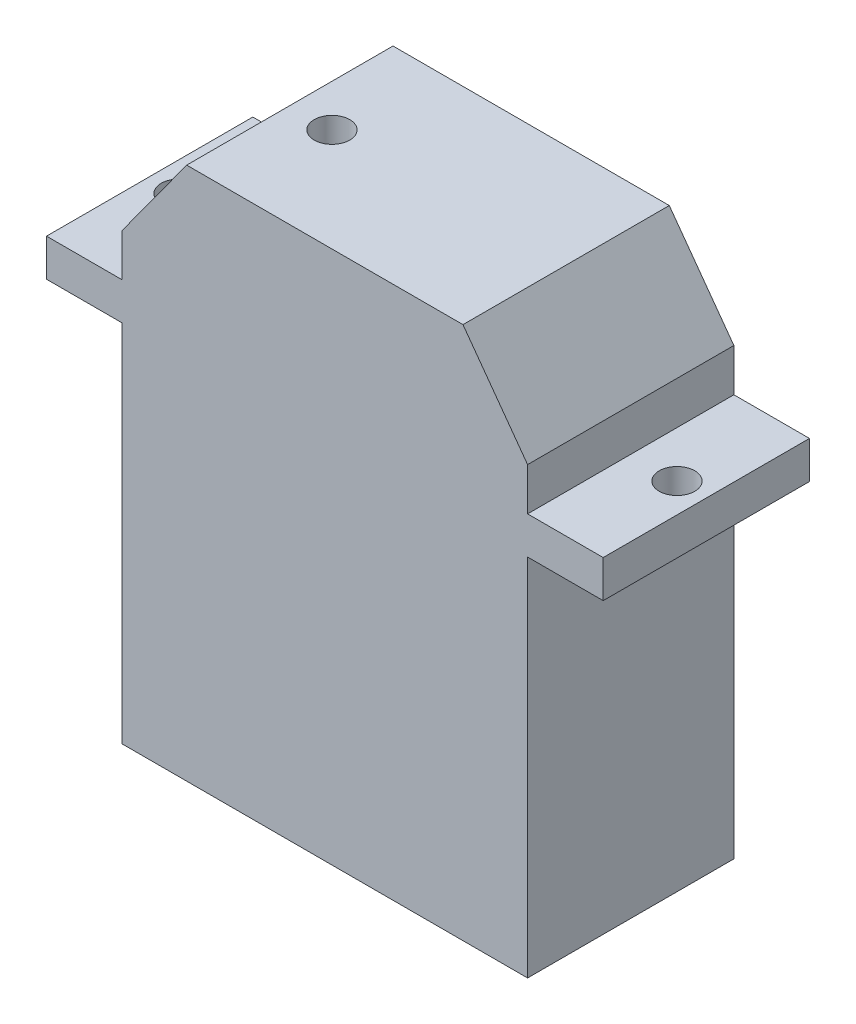
ISO-10303-21;
HEADER;
FILE_DESCRIPTION(('STEP AP214'),'2;1');
FILE_NAME('part.step','',(''),(''),'','','');
FILE_SCHEMA(('AUTOMOTIVE_DESIGN { 1 0 10303 214 1 1 1 1 }'));
ENDSEC;
DATA;
#1=APPLICATION_CONTEXT('core data for automotive mechanical design processes');
#2=APPLICATION_PROTOCOL_DEFINITION('international standard','automotive_design',2000,#1);
#3=PRODUCT_CONTEXT('',#1,'mechanical');
#4=PRODUCT('Part','Part','',(#3));
#5=PRODUCT_RELATED_PRODUCT_CATEGORY('part','',(#4));
#6=PRODUCT_DEFINITION_FORMATION('','',#4);
#7=PRODUCT_DEFINITION_CONTEXT('part definition',#1,'design');
#8=PRODUCT_DEFINITION('design','',#6,#7);
#9=PRODUCT_DEFINITION_SHAPE('','',#8);
#10=(LENGTH_UNIT() NAMED_UNIT(*) SI_UNIT(.MILLI.,.METRE.));
#11=(NAMED_UNIT(*) PLANE_ANGLE_UNIT() SI_UNIT($,.RADIAN.));
#12=(NAMED_UNIT(*) SI_UNIT($,.STERADIAN.) SOLID_ANGLE_UNIT());
#13=UNCERTAINTY_MEASURE_WITH_UNIT(LENGTH_MEASURE(1.E-05),#10,'distance_accuracy_value','');
#14=(GEOMETRIC_REPRESENTATION_CONTEXT(3) GLOBAL_UNCERTAINTY_ASSIGNED_CONTEXT((#13)) GLOBAL_UNIT_ASSIGNED_CONTEXT((#10,
#11,#12)) REPRESENTATION_CONTEXT('',''));
#15=CARTESIAN_POINT('',(0.,0.,0.));
#16=DIRECTION('',(0.,0.,1.));
#17=DIRECTION('',(1.,0.,0.));
#18=AXIS2_PLACEMENT_3D('',#15,#16,#17);
#19=CARTESIAN_POINT('',(11.4,15.,11.6));
#20=DIRECTION('',(-1.,0.,0.));
#21=DIRECTION('',(0.,-1.,0.));
#22=AXIS2_PLACEMENT_3D('',#19,#20,#21);
#23=PLANE('',#22);
#24=DIRECTION('',(0.,1.,0.));
#25=VECTOR('',#24,1.);
#26=CARTESIAN_POINT('',(11.4,15.,0.));
#27=LINE('',#26,#25);
#28=CARTESIAN_POINT('',(11.4,7.6,0.));
#29=VERTEX_POINT('',#28);
#30=CARTESIAN_POINT('',(11.4,9.99999999999997,0.));
#31=VERTEX_POINT('',#30);
#32=EDGE_CURVE('E217',#29,#31,#27,.T.);
#33=ORIENTED_EDGE('',*,*,#32,.T.);
#34=DIRECTION('',(0.,0.,1.));
#35=VECTOR('',#34,1.);
#36=CARTESIAN_POINT('',(11.4,9.99999999999997,11.6));
#37=LINE('',#36,#35);
#38=CARTESIAN_POINT('',(11.4,9.99999999999997,11.6));
#39=VERTEX_POINT('',#38);
#40=EDGE_CURVE('E11',#31,#39,#37,.T.);
#41=ORIENTED_EDGE('',*,*,#40,.T.);
#42=DIRECTION('',(0.,1.,0.));
#43=VECTOR('',#42,1.);
#44=CARTESIAN_POINT('',(11.4,15.,11.6));
#45=LINE('',#44,#43);
#46=CARTESIAN_POINT('',(11.4,7.6,11.6));
#47=VERTEX_POINT('',#46);
#48=EDGE_CURVE('E206',#47,#39,#45,.T.);
#49=ORIENTED_EDGE('',*,*,#48,.F.);
#50=DIRECTION('',(0.,0.,1.));
#51=VECTOR('',#50,1.);
#52=CARTESIAN_POINT('',(11.4,7.6,-4.74051684945851));
#53=LINE('',#52,#51);
#54=EDGE_CURVE('E169',#29,#47,#53,.T.);
#55=ORIENTED_EDGE('',*,*,#54,.F.);
#56=EDGE_LOOP('',(#33,#41,#49,#55));
#57=FACE_BOUND('',#56,.T.);
#58=ADVANCED_FACE('F33',(#57),#23,.F.);
#59=CARTESIAN_POINT('',(-11.4,15.,11.6));
#60=DIRECTION('',(1.,0.,0.));
#61=DIRECTION('',(0.,1.,0.));
#62=AXIS2_PLACEMENT_3D('',#59,#60,#61);
#63=PLANE('',#62);
#64=DIRECTION('',(0.,0.,1.));
#65=VECTOR('',#64,1.);
#66=CARTESIAN_POINT('',(-11.4,5.5,-4.74051684945851));
#67=LINE('',#66,#65);
#68=CARTESIAN_POINT('',(-11.4,5.5,0.));
#69=VERTEX_POINT('',#68);
#70=CARTESIAN_POINT('',(-11.4,5.5,11.6));
#71=VERTEX_POINT('',#70);
#72=EDGE_CURVE('E189',#69,#71,#67,.T.);
#73=ORIENTED_EDGE('',*,*,#72,.F.);
#74=DIRECTION('',(0.,-1.,0.));
#75=VECTOR('',#74,1.);
#76=CARTESIAN_POINT('',(-11.4,15.,0.));
#77=LINE('',#76,#75);
#78=CARTESIAN_POINT('',(-11.4,-15.,0.));
#79=VERTEX_POINT('',#78);
#80=EDGE_CURVE('E200',#69,#79,#77,.T.);
#81=ORIENTED_EDGE('',*,*,#80,.T.);
#82=DIRECTION('',(0.,0.,-1.));
#83=VECTOR('',#82,1.);
#84=CARTESIAN_POINT('',(-11.4,-15.,11.6));
#85=LINE('',#84,#83);
#86=CARTESIAN_POINT('',(-11.4,-15.,11.6));
#87=VERTEX_POINT('',#86);
#88=EDGE_CURVE('E224',#87,#79,#85,.T.);
#89=ORIENTED_EDGE('',*,*,#88,.F.);
#90=DIRECTION('',(0.,-1.,0.));
#91=VECTOR('',#90,1.);
#92=CARTESIAN_POINT('',(-11.4,15.,11.6));
#93=LINE('',#92,#91);
#94=EDGE_CURVE('E204',#71,#87,#93,.T.);
#95=ORIENTED_EDGE('',*,*,#94,.F.);
#96=EDGE_LOOP('',(#73,#81,#89,#95));
#97=FACE_BOUND('',#96,.T.);
#98=ADVANCED_FACE('F302',(#97),#63,.F.);
#99=CARTESIAN_POINT('',(-11.4,9.99999999999996,11.6));
#100=VERTEX_POINT('',#99);
#101=CARTESIAN_POINT('',(-11.4,7.6,11.6));
#102=VERTEX_POINT('',#101);
#103=EDGE_CURVE('E201',#100,#102,#93,.T.);
#104=ORIENTED_EDGE('',*,*,#103,.F.);
#105=DIRECTION('',(0.,0.,-1.));
#106=VECTOR('',#105,1.);
#107=CARTESIAN_POINT('',(-11.4,9.99999999999996,11.6));
#108=LINE('',#107,#106);
#109=CARTESIAN_POINT('',(-11.4,9.99999999999996,0.));
#110=VERTEX_POINT('',#109);
#111=EDGE_CURVE('E227',#100,#110,#108,.T.);
#112=ORIENTED_EDGE('',*,*,#111,.T.);
#113=CARTESIAN_POINT('',(-11.4,7.6,0.));
#114=VERTEX_POINT('',#113);
#115=EDGE_CURVE('E213',#110,#114,#77,.T.);
#116=ORIENTED_EDGE('',*,*,#115,.T.);
#117=DIRECTION('',(0.,0.,1.));
#118=VECTOR('',#117,1.);
#119=CARTESIAN_POINT('',(-11.4,7.6,-4.74051684945851));
#120=LINE('',#119,#118);
#121=EDGE_CURVE('E195',#114,#102,#120,.T.);
#122=ORIENTED_EDGE('',*,*,#121,.T.);
#123=EDGE_LOOP('',(#104,#112,#116,#122));
#124=FACE_BOUND('',#123,.T.);
#125=ADVANCED_FACE('F251',(#124),#63,.F.);
#126=CARTESIAN_POINT('',(11.4,-15.,11.6));
#127=DIRECTION('',(0.,1.,0.));
#128=DIRECTION('',(-1.,0.,0.));
#129=AXIS2_PLACEMENT_3D('',#126,#127,#128);
#130=PLANE('',#129);
#131=DIRECTION('',(1.,0.,0.));
#132=VECTOR('',#131,1.);
#133=CARTESIAN_POINT('',(11.4,-15.,0.));
#134=LINE('',#133,#132);
#135=CARTESIAN_POINT('',(11.4,-15.,0.));
#136=VERTEX_POINT('',#135);
#137=EDGE_CURVE('E215',#79,#136,#134,.T.);
#138=ORIENTED_EDGE('',*,*,#137,.T.);
#139=DIRECTION('',(0.,0.,-1.));
#140=VECTOR('',#139,1.);
#141=CARTESIAN_POINT('',(11.4,-15.,11.6));
#142=LINE('',#141,#140);
#143=CARTESIAN_POINT('',(11.4,-15.,11.6));
#144=VERTEX_POINT('',#143);
#145=EDGE_CURVE('E212',#144,#136,#142,.T.);
#146=ORIENTED_EDGE('',*,*,#145,.F.);
#147=DIRECTION('',(1.,0.,0.));
#148=VECTOR('',#147,1.);
#149=CARTESIAN_POINT('',(11.4,-15.,11.6));
#150=LINE('',#149,#148);
#151=EDGE_CURVE('E203',#87,#144,#150,.T.);
#152=ORIENTED_EDGE('',*,*,#151,.F.);
#153=ORIENTED_EDGE('',*,*,#88,.T.);
#154=EDGE_LOOP('',(#138,#146,#152,#153));
#155=FACE_BOUND('',#154,.T.);
#156=ADVANCED_FACE('F297',(#155),#130,.F.);
#157=CARTESIAN_POINT('',(11.4,5.5,0.));
#158=VERTEX_POINT('',#157);
#159=EDGE_CURVE('E218',#136,#158,#27,.T.);
#160=ORIENTED_EDGE('',*,*,#159,.T.);
#161=DIRECTION('',(0.,0.,1.));
#162=VECTOR('',#161,1.);
#163=CARTESIAN_POINT('',(11.4,5.5,-4.74051684945851));
#164=LINE('',#163,#162);
#165=CARTESIAN_POINT('',(11.4,5.5,11.6));
#166=VERTEX_POINT('',#165);
#167=EDGE_CURVE('E159',#158,#166,#164,.T.);
#168=ORIENTED_EDGE('',*,*,#167,.T.);
#169=EDGE_CURVE('E207',#144,#166,#45,.T.);
#170=ORIENTED_EDGE('',*,*,#169,.F.);
#171=ORIENTED_EDGE('',*,*,#145,.T.);
#172=EDGE_LOOP('',(#160,#168,#170,#171));
#173=FACE_BOUND('',#172,.T.);
#174=ADVANCED_FACE('F290',(#173),#23,.F.);
#175=CARTESIAN_POINT('',(11.4,15.,11.6));
#176=DIRECTION('',(0.,-1.,0.));
#177=DIRECTION('',(1.,0.,0.));
#178=AXIS2_PLACEMENT_3D('',#175,#176,#177);
#179=PLANE('',#178);
#180=CARTESIAN_POINT('',(-5.40000000000001,15.,5.8));
#181=DIRECTION('',(0.,1.,0.));
#182=DIRECTION('',(0.,0.,1.));
#183=AXIS2_PLACEMENT_3D('',#180,#181,#182);
#184=CIRCLE('',#183,1.);
#185=CARTESIAN_POINT('',(-5.40000000000001,15.,6.8));
#186=VERTEX_POINT('',#185);
#187=EDGE_CURVE('E274',#186,#186,#184,.T.);
#188=ORIENTED_EDGE('',*,*,#187,.F.);
#189=EDGE_LOOP('',(#188));
#190=FACE_BOUND('',#189,.T.);
#191=DIRECTION('',(-1.,0.,0.));
#192=VECTOR('',#191,1.);
#193=CARTESIAN_POINT('',(11.4,15.,0.));
#194=LINE('',#193,#192);
#195=CARTESIAN_POINT('',(7.76728735997318,15.,0.));
#196=VERTEX_POINT('',#195);
#197=CARTESIAN_POINT('',(-7.76728735997319,15.,0.));
#198=VERTEX_POINT('',#197);
#199=EDGE_CURVE('E220',#196,#198,#194,.T.);
#200=ORIENTED_EDGE('',*,*,#199,.T.);
#201=DIRECTION('',(0.,0.,1.));
#202=VECTOR('',#201,1.);
#203=CARTESIAN_POINT('',(-7.76728735997319,15.,11.6));
#204=LINE('',#203,#202);
#205=CARTESIAN_POINT('',(-7.76728735997319,15.,11.6));
#206=VERTEX_POINT('',#205);
#207=EDGE_CURVE('E54',#198,#206,#204,.T.);
#208=ORIENTED_EDGE('',*,*,#207,.T.);
#209=DIRECTION('',(-1.,0.,0.));
#210=VECTOR('',#209,1.);
#211=CARTESIAN_POINT('',(11.4,15.,11.6));
#212=LINE('',#211,#210);
#213=CARTESIAN_POINT('',(7.76728735997318,15.,11.6));
#214=VERTEX_POINT('',#213);
#215=EDGE_CURVE('E210',#214,#206,#212,.T.);
#216=ORIENTED_EDGE('',*,*,#215,.F.);
#217=DIRECTION('',(0.,0.,-1.));
#218=VECTOR('',#217,1.);
#219=CARTESIAN_POINT('',(7.76728735997318,15.,11.6));
#220=LINE('',#219,#218);
#221=EDGE_CURVE('E238',#214,#196,#220,.T.);
#222=ORIENTED_EDGE('',*,*,#221,.T.);
#223=EDGE_LOOP('',(#200,#208,#216,#222));
#224=FACE_BOUND('',#223,.T.);
#225=ADVANCED_FACE('F256',(#190,#224),#179,.F.);
#226=CARTESIAN_POINT('',(0.,0.,11.6));
#227=DIRECTION('',(0.,0.,-1.));
#228=DIRECTION('',(-1.,0.,0.));
#229=AXIS2_PLACEMENT_3D('',#226,#227,#228);
#230=PLANE('',#229);
#231=ORIENTED_EDGE('',*,*,#215,.T.);
#232=DIRECTION('',(0.587785252292472,0.809016994374949,0.));
#233=VECTOR('',#232,1.);
#234=CARTESIAN_POINT('',(-11.4,9.99999999999996,11.6));
#235=LINE('',#234,#233);
#236=EDGE_CURVE('E41',#206,#100,#235,.F.);
#237=ORIENTED_EDGE('',*,*,#236,.T.);
#238=ORIENTED_EDGE('',*,*,#103,.T.);
#239=DIRECTION('',(-1.,0.,0.));
#240=VECTOR('',#239,1.);
#241=CARTESIAN_POINT('',(-11.4,7.6,11.6));
#242=LINE('',#241,#240);
#243=CARTESIAN_POINT('',(-15.65,7.6,11.6));
#244=VERTEX_POINT('',#243);
#245=EDGE_CURVE('E174',#102,#244,#242,.T.);
#246=ORIENTED_EDGE('',*,*,#245,.T.);
#247=DIRECTION('',(0.,-1.,0.));
#248=VECTOR('',#247,1.);
#249=CARTESIAN_POINT('',(-15.65,7.6,11.6));
#250=LINE('',#249,#248);
#251=CARTESIAN_POINT('',(-15.65,5.5,11.6));
#252=VERTEX_POINT('',#251);
#253=EDGE_CURVE('E179',#244,#252,#250,.T.);
#254=ORIENTED_EDGE('',*,*,#253,.T.);
#255=DIRECTION('',(1.,0.,0.));
#256=VECTOR('',#255,1.);
#257=CARTESIAN_POINT('',(-11.4,5.5,11.6));
#258=LINE('',#257,#256);
#259=EDGE_CURVE('E175',#252,#71,#258,.T.);
#260=ORIENTED_EDGE('',*,*,#259,.T.);
#261=ORIENTED_EDGE('',*,*,#94,.T.);
#262=ORIENTED_EDGE('',*,*,#151,.T.);
#263=ORIENTED_EDGE('',*,*,#169,.T.);
#264=DIRECTION('',(1.,0.,0.));
#265=VECTOR('',#264,1.);
#266=CARTESIAN_POINT('',(11.4,5.5,11.6));
#267=LINE('',#266,#265);
#268=CARTESIAN_POINT('',(15.65,5.5,11.6));
#269=VERTEX_POINT('',#268);
#270=EDGE_CURVE('E167',#166,#269,#267,.T.);
#271=ORIENTED_EDGE('',*,*,#270,.T.);
#272=DIRECTION('',(0.,1.,0.));
#273=VECTOR('',#272,1.);
#274=CARTESIAN_POINT('',(15.65,7.6,11.6));
#275=LINE('',#274,#273);
#276=CARTESIAN_POINT('',(15.65,7.6,11.6));
#277=VERTEX_POINT('',#276);
#278=EDGE_CURVE('E153',#269,#277,#275,.T.);
#279=ORIENTED_EDGE('',*,*,#278,.T.);
#280=DIRECTION('',(-1.,0.,0.));
#281=VECTOR('',#280,1.);
#282=CARTESIAN_POINT('',(11.4,7.6,11.6));
#283=LINE('',#282,#281);
#284=EDGE_CURVE('E161',#277,#47,#283,.T.);
#285=ORIENTED_EDGE('',*,*,#284,.T.);
#286=ORIENTED_EDGE('',*,*,#48,.T.);
#287=DIRECTION('',(0.587785252292472,-0.809016994374948,0.));
#288=VECTOR('',#287,1.);
#289=CARTESIAN_POINT('',(7.76728735997318,15.,11.6));
#290=LINE('',#289,#288);
#291=EDGE_CURVE('E242',#39,#214,#290,.F.);
#292=ORIENTED_EDGE('',*,*,#291,.T.);
#293=EDGE_LOOP('',(#231,#237,#238,#246,#254,#260,#261,#262,#263,#271,#279,#285,#286,#292));
#294=FACE_BOUND('',#293,.T.);
#295=ADVANCED_FACE('F246',(#294),#230,.F.);
#296=CARTESIAN_POINT('',(0.,0.,0.));
#297=DIRECTION('',(0.,0.,-1.));
#298=DIRECTION('',(-1.,0.,0.));
#299=AXIS2_PLACEMENT_3D('',#296,#297,#298);
#300=PLANE('',#299);
#301=ORIENTED_EDGE('',*,*,#115,.F.);
#302=DIRECTION('',(-0.587785252292472,-0.809016994374949,0.));
#303=VECTOR('',#302,1.);
#304=CARTESIAN_POINT('',(-12.216679449413,8.8759371710076,0.));
#305=LINE('',#304,#303);
#306=EDGE_CURVE('E236',#110,#198,#305,.F.);
#307=ORIENTED_EDGE('',*,*,#306,.T.);
#308=ORIENTED_EDGE('',*,*,#199,.F.);
#309=DIRECTION('',(-0.587785252292472,0.809016994374948,0.));
#310=VECTOR('',#309,1.);
#311=CARTESIAN_POINT('',(12.216679449413,8.87593717100761,0.));
#312=LINE('',#311,#310);
#313=EDGE_CURVE('E234',#196,#31,#312,.F.);
#314=ORIENTED_EDGE('',*,*,#313,.T.);
#315=ORIENTED_EDGE('',*,*,#32,.F.);
#316=DIRECTION('',(-1.,0.,0.));
#317=VECTOR('',#316,1.);
#318=CARTESIAN_POINT('',(11.4,7.6,0.));
#319=LINE('',#318,#317);
#320=CARTESIAN_POINT('',(15.65,7.6,0.));
#321=VERTEX_POINT('',#320);
#322=EDGE_CURVE('E144',#321,#29,#319,.T.);
#323=ORIENTED_EDGE('',*,*,#322,.F.);
#324=DIRECTION('',(0.,1.,0.));
#325=VECTOR('',#324,1.);
#326=CARTESIAN_POINT('',(15.65,7.6,0.));
#327=LINE('',#326,#325);
#328=CARTESIAN_POINT('',(15.65,5.5,0.));
#329=VERTEX_POINT('',#328);
#330=EDGE_CURVE('E135',#329,#321,#327,.T.);
#331=ORIENTED_EDGE('',*,*,#330,.F.);
#332=DIRECTION('',(1.,0.,0.));
#333=VECTOR('',#332,1.);
#334=CARTESIAN_POINT('',(11.4,5.5,0.));
#335=LINE('',#334,#333);
#336=EDGE_CURVE('E141',#158,#329,#335,.T.);
#337=ORIENTED_EDGE('',*,*,#336,.F.);
#338=ORIENTED_EDGE('',*,*,#159,.F.);
#339=ORIENTED_EDGE('',*,*,#137,.F.);
#340=ORIENTED_EDGE('',*,*,#80,.F.);
#341=DIRECTION('',(1.,0.,0.));
#342=VECTOR('',#341,1.);
#343=CARTESIAN_POINT('',(-11.4,5.5,0.));
#344=LINE('',#343,#342);
#345=CARTESIAN_POINT('',(-15.65,5.5,0.));
#346=VERTEX_POINT('',#345);
#347=EDGE_CURVE('E187',#346,#69,#344,.T.);
#348=ORIENTED_EDGE('',*,*,#347,.F.);
#349=DIRECTION('',(0.,-1.,0.));
#350=VECTOR('',#349,1.);
#351=CARTESIAN_POINT('',(-15.65,7.6,0.));
#352=LINE('',#351,#350);
#353=CARTESIAN_POINT('',(-15.65,7.6,0.));
#354=VERTEX_POINT('',#353);
#355=EDGE_CURVE('E191',#354,#346,#352,.T.);
#356=ORIENTED_EDGE('',*,*,#355,.F.);
#357=DIRECTION('',(-1.,0.,0.));
#358=VECTOR('',#357,1.);
#359=CARTESIAN_POINT('',(-11.4,7.6,0.));
#360=LINE('',#359,#358);
#361=EDGE_CURVE('E178',#114,#354,#360,.T.);
#362=ORIENTED_EDGE('',*,*,#361,.F.);
#363=EDGE_LOOP('',(#301,#307,#308,#314,#315,#323,#331,#337,#338,#339,#340,#348,#356,#362));
#364=FACE_BOUND('',#363,.T.);
#365=ADVANCED_FACE('F138',(#364),#300,.T.);
#366=CARTESIAN_POINT('',(-11.4,7.6,-4.74051684945851));
#367=DIRECTION('',(0.,1.,0.));
#368=DIRECTION('',(-1.,0.,0.));
#369=AXIS2_PLACEMENT_3D('',#366,#367,#368);
#370=PLANE('',#369);
#371=CARTESIAN_POINT('',(-14.,7.6,5.8));
#372=DIRECTION('',(0.,1.,0.));
#373=DIRECTION('',(-1.,0.,0.));
#374=AXIS2_PLACEMENT_3D('',#371,#372,#373);
#375=CIRCLE('',#374,1.);
#376=CARTESIAN_POINT('',(-15.,7.6,5.8));
#377=VERTEX_POINT('',#376);
#378=EDGE_CURVE('E267',#377,#377,#375,.T.);
#379=ORIENTED_EDGE('',*,*,#378,.F.);
#380=EDGE_LOOP('',(#379));
#381=FACE_BOUND('',#380,.T.);
#382=ORIENTED_EDGE('',*,*,#121,.F.);
#383=ORIENTED_EDGE('',*,*,#361,.T.);
#384=DIRECTION('',(0.,0.,1.));
#385=VECTOR('',#384,1.);
#386=CARTESIAN_POINT('',(-15.65,7.6,-4.74051684945851));
#387=LINE('',#386,#385);
#388=EDGE_CURVE('E186',#354,#244,#387,.T.);
#389=ORIENTED_EDGE('',*,*,#388,.T.);
#390=ORIENTED_EDGE('',*,*,#245,.F.);
#391=EDGE_LOOP('',(#382,#383,#389,#390));
#392=FACE_BOUND('',#391,.T.);
#393=ADVANCED_FACE('F343',(#381,#392),#370,.T.);
#394=CARTESIAN_POINT('',(-15.65,7.6,-4.74051684945851));
#395=DIRECTION('',(-1.,0.,0.));
#396=DIRECTION('',(0.,-1.,0.));
#397=AXIS2_PLACEMENT_3D('',#394,#395,#396);
#398=PLANE('',#397);
#399=ORIENTED_EDGE('',*,*,#388,.F.);
#400=ORIENTED_EDGE('',*,*,#355,.T.);
#401=DIRECTION('',(0.,0.,1.));
#402=VECTOR('',#401,1.);
#403=CARTESIAN_POINT('',(-15.65,5.5,-4.74051684945851));
#404=LINE('',#403,#402);
#405=EDGE_CURVE('E190',#346,#252,#404,.T.);
#406=ORIENTED_EDGE('',*,*,#405,.T.);
#407=ORIENTED_EDGE('',*,*,#253,.F.);
#408=EDGE_LOOP('',(#399,#400,#406,#407));
#409=FACE_BOUND('',#408,.T.);
#410=ADVANCED_FACE('F339',(#409),#398,.T.);
#411=CARTESIAN_POINT('',(-11.4,5.5,-4.74051684945851));
#412=DIRECTION('',(0.,-1.,0.));
#413=DIRECTION('',(1.,0.,0.));
#414=AXIS2_PLACEMENT_3D('',#411,#412,#413);
#415=PLANE('',#414);
#416=CARTESIAN_POINT('',(-14.,5.5,5.8));
#417=DIRECTION('',(0.,-1.,0.));
#418=DIRECTION('',(1.,0.,0.));
#419=AXIS2_PLACEMENT_3D('',#416,#417,#418);
#420=CIRCLE('',#419,1.);
#421=CARTESIAN_POINT('',(-13.,5.5,5.8));
#422=VERTEX_POINT('',#421);
#423=EDGE_CURVE('E228',#422,#422,#420,.T.);
#424=ORIENTED_EDGE('',*,*,#423,.F.);
#425=EDGE_LOOP('',(#424));
#426=FACE_BOUND('',#425,.T.);
#427=ORIENTED_EDGE('',*,*,#405,.F.);
#428=ORIENTED_EDGE('',*,*,#347,.T.);
#429=ORIENTED_EDGE('',*,*,#72,.T.);
#430=ORIENTED_EDGE('',*,*,#259,.F.);
#431=EDGE_LOOP('',(#427,#428,#429,#430));
#432=FACE_BOUND('',#431,.T.);
#433=ADVANCED_FACE('F335',(#426,#432),#415,.T.);
#434=CARTESIAN_POINT('',(11.4,5.5,-4.74051684945851));
#435=DIRECTION('',(0.,-1.,0.));
#436=DIRECTION('',(0.,0.,-1.));
#437=AXIS2_PLACEMENT_3D('',#434,#435,#436);
#438=PLANE('',#437);
#439=CARTESIAN_POINT('',(14.,5.5,5.8));
#440=DIRECTION('',(0.,-1.,0.));
#441=DIRECTION('',(0.,0.,-1.));
#442=AXIS2_PLACEMENT_3D('',#439,#440,#441);
#443=CIRCLE('',#442,1.);
#444=CARTESIAN_POINT('',(14.,5.5,4.8));
#445=VERTEX_POINT('',#444);
#446=EDGE_CURVE('E231',#445,#445,#443,.T.);
#447=ORIENTED_EDGE('',*,*,#446,.F.);
#448=EDGE_LOOP('',(#447));
#449=FACE_BOUND('',#448,.T.);
#450=ORIENTED_EDGE('',*,*,#167,.F.);
#451=ORIENTED_EDGE('',*,*,#336,.T.);
#452=DIRECTION('',(0.,0.,1.));
#453=VECTOR('',#452,1.);
#454=CARTESIAN_POINT('',(15.65,5.5,-4.74051684945851));
#455=LINE('',#454,#453);
#456=EDGE_CURVE('E148',#329,#269,#455,.T.);
#457=ORIENTED_EDGE('',*,*,#456,.T.);
#458=ORIENTED_EDGE('',*,*,#270,.F.);
#459=EDGE_LOOP('',(#450,#451,#457,#458));
#460=FACE_BOUND('',#459,.T.);
#461=ADVANCED_FACE('F157',(#449,#460),#438,.T.);
#462=CARTESIAN_POINT('',(15.65,7.6,-4.74051684945851));
#463=DIRECTION('',(1.,0.,0.));
#464=DIRECTION('',(0.,1.,0.));
#465=AXIS2_PLACEMENT_3D('',#462,#463,#464);
#466=PLANE('',#465);
#467=ORIENTED_EDGE('',*,*,#456,.F.);
#468=ORIENTED_EDGE('',*,*,#330,.T.);
#469=DIRECTION('',(0.,0.,1.));
#470=VECTOR('',#469,1.);
#471=CARTESIAN_POINT('',(15.65,7.6,-4.74051684945851));
#472=LINE('',#471,#470);
#473=EDGE_CURVE('E147',#321,#277,#472,.T.);
#474=ORIENTED_EDGE('',*,*,#473,.T.);
#475=ORIENTED_EDGE('',*,*,#278,.F.);
#476=EDGE_LOOP('',(#467,#468,#474,#475));
#477=FACE_BOUND('',#476,.T.);
#478=ADVANCED_FACE('F151',(#477),#466,.T.);
#479=CARTESIAN_POINT('',(11.4,7.6,-4.74051684945851));
#480=DIRECTION('',(0.,1.,0.));
#481=DIRECTION('',(-1.,0.,0.));
#482=AXIS2_PLACEMENT_3D('',#479,#480,#481);
#483=PLANE('',#482);
#484=CARTESIAN_POINT('',(14.,7.60000000000001,5.8));
#485=DIRECTION('',(0.,1.,0.));
#486=DIRECTION('',(1.,0.,0.));
#487=AXIS2_PLACEMENT_3D('',#484,#485,#486);
#488=CIRCLE('',#487,1.);
#489=CARTESIAN_POINT('',(15.,7.60000000000001,5.8));
#490=VERTEX_POINT('',#489);
#491=EDGE_CURVE('E268',#490,#490,#488,.T.);
#492=ORIENTED_EDGE('',*,*,#491,.F.);
#493=EDGE_LOOP('',(#492));
#494=FACE_BOUND('',#493,.T.);
#495=ORIENTED_EDGE('',*,*,#473,.F.);
#496=ORIENTED_EDGE('',*,*,#322,.T.);
#497=ORIENTED_EDGE('',*,*,#54,.T.);
#498=ORIENTED_EDGE('',*,*,#284,.F.);
#499=EDGE_LOOP('',(#495,#496,#497,#498));
#500=FACE_BOUND('',#499,.T.);
#501=ADVANCED_FACE('F263',(#494,#500),#483,.T.);
#502=CARTESIAN_POINT('',(14.,-3.99999999999999,5.8));
#503=DIRECTION('',(0.,1.,0.));
#504=DIRECTION('',(-1.,0.,0.));
#505=AXIS2_PLACEMENT_3D('',#502,#503,#504);
#506=CYLINDRICAL_SURFACE('',#505,1.);
#507=ORIENTED_EDGE('',*,*,#446,.T.);
#508=EDGE_LOOP('',(#507));
#509=FACE_BOUND('',#508,.T.);
#510=ORIENTED_EDGE('',*,*,#491,.T.);
#511=EDGE_LOOP('',(#510));
#512=FACE_BOUND('',#511,.T.);
#513=ADVANCED_FACE('F323',(#509,#512),#506,.F.);
#514=CARTESIAN_POINT('',(-14.,-4.,5.8));
#515=DIRECTION('',(0.,1.,0.));
#516=DIRECTION('',(-1.,0.,0.));
#517=AXIS2_PLACEMENT_3D('',#514,#515,#516);
#518=CYLINDRICAL_SURFACE('',#517,1.);
#519=ORIENTED_EDGE('',*,*,#423,.T.);
#520=EDGE_LOOP('',(#519));
#521=FACE_BOUND('',#520,.T.);
#522=ORIENTED_EDGE('',*,*,#378,.T.);
#523=EDGE_LOOP('',(#522));
#524=FACE_BOUND('',#523,.T.);
#525=ADVANCED_FACE('F285',(#521,#524),#518,.F.);
#526=CARTESIAN_POINT('',(-5.40000000000001,10.,5.8));
#527=DIRECTION('',(0.,1.,0.));
#528=DIRECTION('',(0.,0.,1.));
#529=AXIS2_PLACEMENT_3D('',#526,#527,#528);
#530=CYLINDRICAL_SURFACE('',#529,1.);
#531=CARTESIAN_POINT('',(-5.40000000000001,10.,5.8));
#532=DIRECTION('',(0.,1.,0.));
#533=DIRECTION('',(0.,0.,1.));
#534=AXIS2_PLACEMENT_3D('',#531,#532,#533);
#535=CIRCLE('',#534,1.);
#536=CARTESIAN_POINT('',(-5.40000000000001,10.,6.8));
#537=VERTEX_POINT('',#536);
#538=EDGE_CURVE('E271',#537,#537,#535,.T.);
#539=ORIENTED_EDGE('',*,*,#538,.F.);
#540=EDGE_LOOP('',(#539));
#541=FACE_BOUND('',#540,.T.);
#542=ORIENTED_EDGE('',*,*,#187,.T.);
#543=EDGE_LOOP('',(#542));
#544=FACE_BOUND('',#543,.T.);
#545=ADVANCED_FACE('F282',(#541,#544),#530,.F.);
#546=CARTESIAN_POINT('',(-5.40000000000001,10.,5.8));
#547=DIRECTION('',(0.,1.,0.));
#548=DIRECTION('',(0.,0.,1.));
#549=AXIS2_PLACEMENT_3D('',#546,#547,#548);
#550=PLANE('',#549);
#551=ORIENTED_EDGE('',*,*,#538,.T.);
#552=EDGE_LOOP('',(#551));
#553=FACE_BOUND('',#552,.T.);
#554=ADVANCED_FACE('F280',(#553),#550,.T.);
#555=CARTESIAN_POINT('',(-11.4,9.99999999999996,11.6));
#556=DIRECTION('',(0.809016994374948,-0.587785252292471,0.));
#557=DIRECTION('',(0.,0.,-1.));
#558=AXIS2_PLACEMENT_3D('',#555,#556,#557);
#559=PLANE('',#558);
#560=ORIENTED_EDGE('',*,*,#236,.F.);
#561=ORIENTED_EDGE('',*,*,#207,.F.);
#562=ORIENTED_EDGE('',*,*,#306,.F.);
#563=ORIENTED_EDGE('',*,*,#111,.F.);
#564=EDGE_LOOP('',(#560,#561,#562,#563));
#565=FACE_BOUND('',#564,.T.);
#566=ADVANCED_FACE('F253',(#565),#559,.F.);
#567=CARTESIAN_POINT('',(7.76728735997318,15.,11.6));
#568=DIRECTION('',(-0.809016994374948,-0.587785252292472,0.));
#569=DIRECTION('',(0.,0.,-1.));
#570=AXIS2_PLACEMENT_3D('',#567,#568,#569);
#571=PLANE('',#570);
#572=ORIENTED_EDGE('',*,*,#291,.F.);
#573=ORIENTED_EDGE('',*,*,#40,.F.);
#574=ORIENTED_EDGE('',*,*,#313,.F.);
#575=ORIENTED_EDGE('',*,*,#221,.F.);
#576=EDGE_LOOP('',(#572,#573,#574,#575));
#577=FACE_BOUND('',#576,.T.);
#578=ADVANCED_FACE('F35',(#577),#571,.F.);
#579=CLOSED_SHELL('',(#58,#98,#125,#156,#174,#225,#295,#365,#393,#410,#433,#461,#478,#501,#513,
#525,#545,#554,#566,#578));
#580=MANIFOLD_SOLID_BREP('B2',#579);
#581=ADVANCED_BREP_SHAPE_REPRESENTATION('',(#18,#580),#14);
#582=SHAPE_DEFINITION_REPRESENTATION(#9,#581);
ENDSEC;
END-ISO-10303-21;
